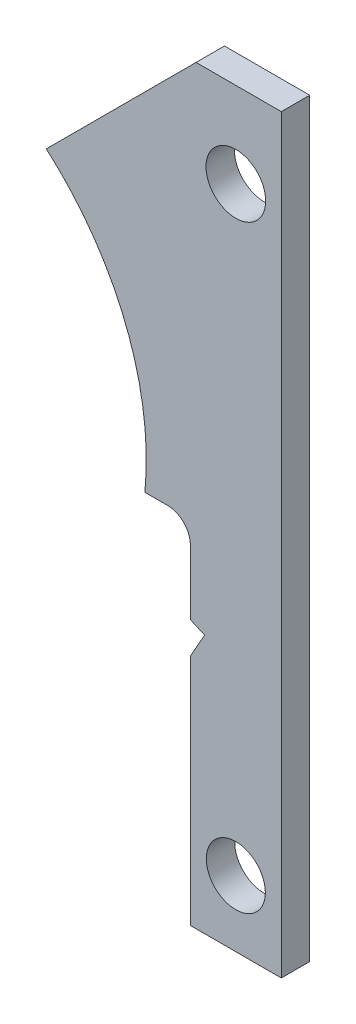
ISO-10303-21;
HEADER;
FILE_DESCRIPTION(('STEP AP214'),'2;1');
FILE_NAME('part.step','',(''),(''),'','','');
FILE_SCHEMA(('AUTOMOTIVE_DESIGN { 1 0 10303 214 1 1 1 1 }'));
ENDSEC;
DATA;
#1=APPLICATION_CONTEXT('core data for automotive mechanical design processes');
#2=APPLICATION_PROTOCOL_DEFINITION('international standard','automotive_design',2000,#1);
#3=PRODUCT_CONTEXT('',#1,'mechanical');
#4=PRODUCT('Part','Part','',(#3));
#5=PRODUCT_RELATED_PRODUCT_CATEGORY('part','',(#4));
#6=PRODUCT_DEFINITION_FORMATION('','',#4);
#7=PRODUCT_DEFINITION_CONTEXT('part definition',#1,'design');
#8=PRODUCT_DEFINITION('design','',#6,#7);
#9=PRODUCT_DEFINITION_SHAPE('','',#8);
#10=(LENGTH_UNIT() NAMED_UNIT(*) SI_UNIT(.MILLI.,.METRE.));
#11=(NAMED_UNIT(*) PLANE_ANGLE_UNIT() SI_UNIT($,.RADIAN.));
#12=(NAMED_UNIT(*) SI_UNIT($,.STERADIAN.) SOLID_ANGLE_UNIT());
#13=UNCERTAINTY_MEASURE_WITH_UNIT(LENGTH_MEASURE(1.E-05),#10,'distance_accuracy_value','');
#14=(GEOMETRIC_REPRESENTATION_CONTEXT(3) GLOBAL_UNCERTAINTY_ASSIGNED_CONTEXT((#13)) GLOBAL_UNIT_ASSIGNED_CONTEXT((#10,
#11,#12)) REPRESENTATION_CONTEXT('',''));
#15=CARTESIAN_POINT('',(0.,0.,0.));
#16=DIRECTION('',(0.,0.,1.));
#17=DIRECTION('',(1.,0.,0.));
#18=AXIS2_PLACEMENT_3D('',#15,#16,#17);
#19=CARTESIAN_POINT('',(795.076378776782,63.8094152835061,5.));
#20=DIRECTION('',(0.,0.,1.));
#21=DIRECTION('',(1.,0.,0.));
#22=AXIS2_PLACEMENT_3D('',#19,#20,#21);
#23=PLANE('',#22);
#24=CARTESIAN_POINT('',(794.600000000013,64.8000047087015,5.));
#25=DIRECTION('',(0.,0.,1.));
#26=DIRECTION('',(1.,0.,0.));
#27=AXIS2_PLACEMENT_3D('',#24,#25,#26);
#28=CIRCLE('',#27,51.25);
#29=CARTESIAN_POINT('',(845.60551440777,59.8000047087011,5.));
#30=VERTEX_POINT('',#29);
#31=CARTESIAN_POINT('',(828.252887159962,103.45289186865,5.));
#32=VERTEX_POINT('',#31);
#33=EDGE_CURVE('E48',#30,#32,#28,.T.);
#34=ORIENTED_EDGE('',*,*,#33,.F.);
#35=DIRECTION('',(1.,0.,0.));
#36=VECTOR('',#35,1.);
#37=CARTESIAN_POINT('',(820.028101645404,59.8000047086987,5.));
#38=LINE('',#37,#36);
#39=CARTESIAN_POINT('',(849.600001490012,59.8000047087015,5.));
#40=VERTEX_POINT('',#39);
#41=EDGE_CURVE('E99',#30,#40,#38,.T.);
#42=ORIENTED_EDGE('',*,*,#41,.T.);
#43=CARTESIAN_POINT('',(849.600001490012,55.8000047087015,5.));
#44=DIRECTION('',(0.,0.,-1.));
#45=DIRECTION('',(1.,0.,0.));
#46=AXIS2_PLACEMENT_3D('',#43,#44,#45);
#47=CIRCLE('',#46,4.);
#48=CARTESIAN_POINT('',(853.600001490012,55.8000047087015,5.));
#49=VERTEX_POINT('',#48);
#50=EDGE_CURVE('E184',#40,#49,#47,.T.);
#51=ORIENTED_EDGE('',*,*,#50,.T.);
#52=DIRECTION('',(0.,-1.,0.));
#53=VECTOR('',#52,1.);
#54=CARTESIAN_POINT('',(853.600001490012,55.8000047087015,5.));
#55=LINE('',#54,#53);
#56=CARTESIAN_POINT('',(853.600001490012,44.4001544028015,5.));
#57=VERTEX_POINT('',#56);
#58=EDGE_CURVE('E206',#49,#57,#55,.T.);
#59=ORIENTED_EDGE('',*,*,#58,.T.);
#60=DIRECTION('',(0.915294684400679,-0.402784856601961,0.));
#61=VECTOR('',#60,1.);
#62=CARTESIAN_POINT('',(853.600001490012,44.4001544028015,5.));
#63=LINE('',#62,#61);
#64=CARTESIAN_POINT('',(856.099999798813,43.3000043883015,5.));
#65=VERTEX_POINT('',#64);
#66=EDGE_CURVE('E203',#57,#65,#63,.T.);
#67=ORIENTED_EDGE('',*,*,#66,.T.);
#68=DIRECTION('',(-0.488075249911389,-0.872801552716272,0.));
#69=VECTOR('',#68,1.);
#70=CARTESIAN_POINT('',(856.099999798813,43.3000043883015,5.));
#71=LINE('',#70,#69);
#72=CARTESIAN_POINT('',(853.600001490012,38.8293773567015,5.));
#73=VERTEX_POINT('',#72);
#74=EDGE_CURVE('E205',#65,#73,#71,.T.);
#75=ORIENTED_EDGE('',*,*,#74,.T.);
#76=DIRECTION('',(0.,-1.,0.));
#77=VECTOR('',#76,1.);
#78=CARTESIAN_POINT('',(853.600001490012,38.8293773567015,5.));
#79=LINE('',#78,#77);
#80=CARTESIAN_POINT('',(853.600001490012,-2.19999390319852,5.));
#81=VERTEX_POINT('',#80);
#82=EDGE_CURVE('E125',#73,#81,#79,.T.);
#83=ORIENTED_EDGE('',*,*,#82,.T.);
#84=DIRECTION('',(1.,0.,0.));
#85=VECTOR('',#84,1.);
#86=CARTESIAN_POINT('',(853.600001490012,-2.19999390319852,5.));
#87=LINE('',#86,#85);
#88=CARTESIAN_POINT('',(869.600000000013,-2.19999390319852,5.));
#89=VERTEX_POINT('',#88);
#90=EDGE_CURVE('E118',#81,#89,#87,.T.);
#91=ORIENTED_EDGE('',*,*,#90,.T.);
#92=DIRECTION('',(0.,1.,0.));
#93=VECTOR('',#92,1.);
#94=CARTESIAN_POINT('',(869.600000000013,-2.19999390319852,5.));
#95=LINE('',#94,#93);
#96=CARTESIAN_POINT('',(869.600000000013,129.800004708701,5.));
#97=VERTEX_POINT('',#96);
#98=EDGE_CURVE('E122',#89,#97,#95,.T.);
#99=ORIENTED_EDGE('',*,*,#98,.T.);
#100=DIRECTION('',(-1.,0.,0.));
#101=VECTOR('',#100,1.);
#102=CARTESIAN_POINT('',(869.600000000013,129.800004708701,5.));
#103=LINE('',#102,#101);
#104=CARTESIAN_POINT('',(854.600000000013,129.800004708701,5.));
#105=VERTEX_POINT('',#104);
#106=EDGE_CURVE('E56',#97,#105,#103,.T.);
#107=ORIENTED_EDGE('',*,*,#106,.T.);
#108=DIRECTION('',(-0.707106781186541,-0.707106781186555,0.));
#109=VECTOR('',#108,1.);
#110=CARTESIAN_POINT('',(854.600000000013,129.800004708701,5.));
#111=LINE('',#110,#109);
#112=EDGE_CURVE('E222',#105,#32,#111,.T.);
#113=ORIENTED_EDGE('',*,*,#112,.T.);
#114=EDGE_LOOP('',(#34,#42,#51,#59,#67,#75,#83,#91,#99,#107,#113));
#115=FACE_BOUND('',#114,.T.);
#116=CARTESIAN_POINT('',(861.600000000013,9.39149717140147,5.));
#117=DIRECTION('',(0.,0.,1.));
#118=DIRECTION('',(1.,0.,0.));
#119=AXIS2_PLACEMENT_3D('',#116,#117,#118);
#120=CIRCLE('',#119,5.19190313570428);
#121=CARTESIAN_POINT('',(866.791903135717,9.39149717140147,5.));
#122=VERTEX_POINT('',#121);
#123=EDGE_CURVE('E149',#122,#122,#120,.T.);
#124=ORIENTED_EDGE('',*,*,#123,.F.);
#125=EDGE_LOOP('',(#124));
#126=FACE_BOUND('',#125,.T.);
#127=CARTESIAN_POINT('',(861.600000000013,114.800004708701,5.));
#128=DIRECTION('',(0.,0.,1.));
#129=DIRECTION('',(1.,0.,0.));
#130=AXIS2_PLACEMENT_3D('',#127,#128,#129);
#131=CIRCLE('',#130,5.24999999999987);
#132=CARTESIAN_POINT('',(866.850000000012,114.800004708701,5.));
#133=VERTEX_POINT('',#132);
#134=EDGE_CURVE('E216',#133,#133,#131,.T.);
#135=ORIENTED_EDGE('',*,*,#134,.F.);
#136=EDGE_LOOP('',(#135));
#137=FACE_BOUND('',#136,.T.);
#138=ADVANCED_FACE('F33',(#115,#126,#137),#23,.T.);
#139=CARTESIAN_POINT('',(795.076378776782,63.8094152835061,0.));
#140=DIRECTION('',(0.,0.,1.));
#141=DIRECTION('',(1.,0.,0.));
#142=AXIS2_PLACEMENT_3D('',#139,#140,#141);
#143=PLANE('',#142);
#144=DIRECTION('',(1.,0.,0.));
#145=VECTOR('',#144,1.);
#146=CARTESIAN_POINT('',(820.028101645404,59.8000047086987,0.));
#147=LINE('',#146,#145);
#148=CARTESIAN_POINT('',(845.60551440777,59.8000047087011,0.));
#149=VERTEX_POINT('',#148);
#150=CARTESIAN_POINT('',(849.600001490012,59.8000047087015,0.));
#151=VERTEX_POINT('',#150);
#152=EDGE_CURVE('E146',#149,#151,#147,.T.);
#153=ORIENTED_EDGE('',*,*,#152,.F.);
#154=CARTESIAN_POINT('',(794.600000000013,64.8000047087015,0.));
#155=DIRECTION('',(0.,0.,-1.));
#156=DIRECTION('',(-1.,0.,0.));
#157=AXIS2_PLACEMENT_3D('',#154,#155,#156);
#158=CIRCLE('',#157,51.25);
#159=CARTESIAN_POINT('',(828.252887159962,103.45289186865,0.));
#160=VERTEX_POINT('',#159);
#161=EDGE_CURVE('E233',#160,#149,#158,.T.);
#162=ORIENTED_EDGE('',*,*,#161,.F.);
#163=DIRECTION('',(-0.707106781186541,-0.707106781186555,0.));
#164=VECTOR('',#163,1.);
#165=CARTESIAN_POINT('',(854.600000000013,129.800004708701,0.));
#166=LINE('',#165,#164);
#167=CARTESIAN_POINT('',(854.600000000013,129.800004708701,0.));
#168=VERTEX_POINT('',#167);
#169=EDGE_CURVE('E225',#168,#160,#166,.T.);
#170=ORIENTED_EDGE('',*,*,#169,.F.);
#171=DIRECTION('',(-1.,0.,0.));
#172=VECTOR('',#171,1.);
#173=CARTESIAN_POINT('',(869.600000000013,129.800004708701,0.));
#174=LINE('',#173,#172);
#175=CARTESIAN_POINT('',(869.600000000013,129.800004708701,0.));
#176=VERTEX_POINT('',#175);
#177=EDGE_CURVE('E92',#176,#168,#174,.T.);
#178=ORIENTED_EDGE('',*,*,#177,.F.);
#179=DIRECTION('',(0.,1.,0.));
#180=VECTOR('',#179,1.);
#181=CARTESIAN_POINT('',(869.600000000013,-2.19999390319852,0.));
#182=LINE('',#181,#180);
#183=CARTESIAN_POINT('',(869.600000000013,-2.19999390319852,0.));
#184=VERTEX_POINT('',#183);
#185=EDGE_CURVE('E160',#184,#176,#182,.T.);
#186=ORIENTED_EDGE('',*,*,#185,.F.);
#187=DIRECTION('',(1.,0.,0.));
#188=VECTOR('',#187,1.);
#189=CARTESIAN_POINT('',(853.600001490012,-2.19999390319852,0.));
#190=LINE('',#189,#188);
#191=CARTESIAN_POINT('',(853.600001490012,-2.19999390319852,0.));
#192=VERTEX_POINT('',#191);
#193=EDGE_CURVE('E134',#192,#184,#190,.T.);
#194=ORIENTED_EDGE('',*,*,#193,.F.);
#195=DIRECTION('',(0.,-1.,0.));
#196=VECTOR('',#195,1.);
#197=CARTESIAN_POINT('',(853.600001490012,38.8293773567015,0.));
#198=LINE('',#197,#196);
#199=CARTESIAN_POINT('',(853.600001490012,38.8293773567015,0.));
#200=VERTEX_POINT('',#199);
#201=EDGE_CURVE('E157',#200,#192,#198,.T.);
#202=ORIENTED_EDGE('',*,*,#201,.F.);
#203=DIRECTION('',(-0.488075249911389,-0.872801552716272,0.));
#204=VECTOR('',#203,1.);
#205=CARTESIAN_POINT('',(856.099999798813,43.3000043883015,0.));
#206=LINE('',#205,#204);
#207=CARTESIAN_POINT('',(856.099999798813,43.3000043883015,0.));
#208=VERTEX_POINT('',#207);
#209=EDGE_CURVE('E155',#208,#200,#206,.T.);
#210=ORIENTED_EDGE('',*,*,#209,.F.);
#211=DIRECTION('',(0.915294684400679,-0.402784856601961,0.));
#212=VECTOR('',#211,1.);
#213=CARTESIAN_POINT('',(853.600001490012,44.4001544028015,0.));
#214=LINE('',#213,#212);
#215=CARTESIAN_POINT('',(853.600001490012,44.4001544028015,0.));
#216=VERTEX_POINT('',#215);
#217=EDGE_CURVE('E153',#216,#208,#214,.T.);
#218=ORIENTED_EDGE('',*,*,#217,.F.);
#219=DIRECTION('',(0.,-1.,0.));
#220=VECTOR('',#219,1.);
#221=CARTESIAN_POINT('',(853.600001490012,55.8000047087015,0.));
#222=LINE('',#221,#220);
#223=CARTESIAN_POINT('',(853.600001490012,55.8000047087015,0.));
#224=VERTEX_POINT('',#223);
#225=EDGE_CURVE('E151',#224,#216,#222,.T.);
#226=ORIENTED_EDGE('',*,*,#225,.F.);
#227=CARTESIAN_POINT('',(849.600001490012,55.8000047087015,0.));
#228=DIRECTION('',(0.,0.,-1.));
#229=DIRECTION('',(1.,0.,0.));
#230=AXIS2_PLACEMENT_3D('',#227,#228,#229);
#231=CIRCLE('',#230,4.);
#232=EDGE_CURVE('E148',#151,#224,#231,.T.);
#233=ORIENTED_EDGE('',*,*,#232,.F.);
#234=EDGE_LOOP('',(#153,#162,#170,#178,#186,#194,#202,#210,#218,#226,#233));
#235=FACE_BOUND('',#234,.T.);
#236=CARTESIAN_POINT('',(861.600000000013,114.800004708701,0.));
#237=DIRECTION('',(0.,0.,1.));
#238=DIRECTION('',(1.,0.,0.));
#239=AXIS2_PLACEMENT_3D('',#236,#237,#238);
#240=CIRCLE('',#239,5.24999999999987);
#241=CARTESIAN_POINT('',(866.850000000012,114.800004708701,0.));
#242=VERTEX_POINT('',#241);
#243=EDGE_CURVE('E219',#242,#242,#240,.T.);
#244=ORIENTED_EDGE('',*,*,#243,.T.);
#245=EDGE_LOOP('',(#244));
#246=FACE_BOUND('',#245,.T.);
#247=CARTESIAN_POINT('',(861.600000000013,9.39149717140147,0.));
#248=DIRECTION('',(0.,0.,1.));
#249=DIRECTION('',(1.,0.,0.));
#250=AXIS2_PLACEMENT_3D('',#247,#248,#249);
#251=CIRCLE('',#250,5.19190313570428);
#252=CARTESIAN_POINT('',(866.791903135717,9.39149717140147,0.));
#253=VERTEX_POINT('',#252);
#254=EDGE_CURVE('E213',#253,#253,#251,.T.);
#255=ORIENTED_EDGE('',*,*,#254,.T.);
#256=EDGE_LOOP('',(#255));
#257=FACE_BOUND('',#256,.T.);
#258=ADVANCED_FACE('F189',(#235,#246,#257),#143,.F.);
#259=CARTESIAN_POINT('',(820.028101645404,59.8000047086987,5.));
#260=DIRECTION('',(0.,1.,0.));
#261=DIRECTION('',(-1.,0.,0.));
#262=AXIS2_PLACEMENT_3D('',#259,#260,#261);
#263=PLANE('',#262);
#264=ORIENTED_EDGE('',*,*,#41,.F.);
#265=DIRECTION('',(0.,0.,-1.));
#266=VECTOR('',#265,1.);
#267=CARTESIAN_POINT('',(845.60551440777,59.8000047087011,6.));
#268=LINE('',#267,#266);
#269=EDGE_CURVE('E228',#30,#149,#268,.T.);
#270=ORIENTED_EDGE('',*,*,#269,.T.);
#271=ORIENTED_EDGE('',*,*,#152,.T.);
#272=DIRECTION('',(0.,0.,-1.));
#273=VECTOR('',#272,1.);
#274=CARTESIAN_POINT('',(849.600001490012,59.8000047087015,5.));
#275=LINE('',#274,#273);
#276=EDGE_CURVE('E41',#40,#151,#275,.T.);
#277=ORIENTED_EDGE('',*,*,#276,.F.);
#278=EDGE_LOOP('',(#264,#270,#271,#277));
#279=FACE_BOUND('',#278,.T.);
#280=ADVANCED_FACE('F35',(#279),#263,.F.);
#281=CARTESIAN_POINT('',(849.600001490012,55.8000047087015,5.));
#282=DIRECTION('',(0.,0.,-1.));
#283=DIRECTION('',(-1.,0.,0.));
#284=AXIS2_PLACEMENT_3D('',#281,#282,#283);
#285=CYLINDRICAL_SURFACE('',#284,4.);
#286=ORIENTED_EDGE('',*,*,#232,.T.);
#287=DIRECTION('',(0.,0.,-1.));
#288=VECTOR('',#287,1.);
#289=CARTESIAN_POINT('',(853.600001490012,55.8000047087015,5.));
#290=LINE('',#289,#288);
#291=EDGE_CURVE('E176',#49,#224,#290,.T.);
#292=ORIENTED_EDGE('',*,*,#291,.F.);
#293=ORIENTED_EDGE('',*,*,#50,.F.);
#294=ORIENTED_EDGE('',*,*,#276,.T.);
#295=EDGE_LOOP('',(#286,#292,#293,#294));
#296=FACE_BOUND('',#295,.T.);
#297=ADVANCED_FACE('F182',(#296),#285,.F.);
#298=CARTESIAN_POINT('',(853.600001490012,55.8000047087015,5.));
#299=DIRECTION('',(1.,0.,0.));
#300=DIRECTION('',(0.,0.,-1.));
#301=AXIS2_PLACEMENT_3D('',#298,#299,#300);
#302=PLANE('',#301);
#303=ORIENTED_EDGE('',*,*,#225,.T.);
#304=DIRECTION('',(0.,0.,-1.));
#305=VECTOR('',#304,1.);
#306=CARTESIAN_POINT('',(853.600001490012,44.4001544028015,5.));
#307=LINE('',#306,#305);
#308=EDGE_CURVE('E173',#57,#216,#307,.T.);
#309=ORIENTED_EDGE('',*,*,#308,.F.);
#310=ORIENTED_EDGE('',*,*,#58,.F.);
#311=ORIENTED_EDGE('',*,*,#291,.T.);
#312=EDGE_LOOP('',(#303,#309,#310,#311));
#313=FACE_BOUND('',#312,.T.);
#314=ADVANCED_FACE('F197',(#313),#302,.F.);
#315=CARTESIAN_POINT('',(853.600001490012,44.4001544028015,5.));
#316=DIRECTION('',(0.402784856601961,0.915294684400679,0.));
#317=DIRECTION('',(-0.915294684400679,0.402784856601961,0.));
#318=AXIS2_PLACEMENT_3D('',#315,#316,#317);
#319=PLANE('',#318);
#320=ORIENTED_EDGE('',*,*,#217,.T.);
#321=DIRECTION('',(0.,0.,-1.));
#322=VECTOR('',#321,1.);
#323=CARTESIAN_POINT('',(856.099999798813,43.3000043883015,5.));
#324=LINE('',#323,#322);
#325=EDGE_CURVE('E170',#65,#208,#324,.T.);
#326=ORIENTED_EDGE('',*,*,#325,.F.);
#327=ORIENTED_EDGE('',*,*,#66,.F.);
#328=ORIENTED_EDGE('',*,*,#308,.T.);
#329=EDGE_LOOP('',(#320,#326,#327,#328));
#330=FACE_BOUND('',#329,.T.);
#331=ADVANCED_FACE('F201',(#330),#319,.F.);
#332=CARTESIAN_POINT('',(856.099999798813,43.3000043883015,5.));
#333=DIRECTION('',(0.872801552716272,-0.488075249911389,0.));
#334=DIRECTION('',(0.488075249911389,0.872801552716272,0.));
#335=AXIS2_PLACEMENT_3D('',#332,#333,#334);
#336=PLANE('',#335);
#337=ORIENTED_EDGE('',*,*,#209,.T.);
#338=DIRECTION('',(0.,0.,-1.));
#339=VECTOR('',#338,1.);
#340=CARTESIAN_POINT('',(853.600001490012,38.8293773567015,5.));
#341=LINE('',#340,#339);
#342=EDGE_CURVE('E167',#73,#200,#341,.T.);
#343=ORIENTED_EDGE('',*,*,#342,.F.);
#344=ORIENTED_EDGE('',*,*,#74,.F.);
#345=ORIENTED_EDGE('',*,*,#325,.T.);
#346=EDGE_LOOP('',(#337,#343,#344,#345));
#347=FACE_BOUND('',#346,.T.);
#348=ADVANCED_FACE('F261',(#347),#336,.F.);
#349=CARTESIAN_POINT('',(853.600001490012,38.8293773567015,5.));
#350=DIRECTION('',(1.,0.,0.));
#351=DIRECTION('',(0.,0.,-1.));
#352=AXIS2_PLACEMENT_3D('',#349,#350,#351);
#353=PLANE('',#352);
#354=ORIENTED_EDGE('',*,*,#201,.T.);
#355=DIRECTION('',(0.,0.,-1.));
#356=VECTOR('',#355,1.);
#357=CARTESIAN_POINT('',(853.600001490012,-2.19999390319852,5.));
#358=LINE('',#357,#356);
#359=EDGE_CURVE('E137',#81,#192,#358,.T.);
#360=ORIENTED_EDGE('',*,*,#359,.F.);
#361=ORIENTED_EDGE('',*,*,#82,.F.);
#362=ORIENTED_EDGE('',*,*,#342,.T.);
#363=EDGE_LOOP('',(#354,#360,#361,#362));
#364=FACE_BOUND('',#363,.T.);
#365=ADVANCED_FACE('F258',(#364),#353,.F.);
#366=CARTESIAN_POINT('',(853.600001490012,-2.19999390319852,5.));
#367=DIRECTION('',(0.,1.,0.));
#368=DIRECTION('',(0.,0.,1.));
#369=AXIS2_PLACEMENT_3D('',#366,#367,#368);
#370=PLANE('',#369);
#371=ORIENTED_EDGE('',*,*,#193,.T.);
#372=DIRECTION('',(0.,0.,-1.));
#373=VECTOR('',#372,1.);
#374=CARTESIAN_POINT('',(869.600000000013,-2.19999390319852,5.));
#375=LINE('',#374,#373);
#376=EDGE_CURVE('E131',#89,#184,#375,.T.);
#377=ORIENTED_EDGE('',*,*,#376,.F.);
#378=ORIENTED_EDGE('',*,*,#90,.F.);
#379=ORIENTED_EDGE('',*,*,#359,.T.);
#380=EDGE_LOOP('',(#371,#377,#378,#379));
#381=FACE_BOUND('',#380,.T.);
#382=ADVANCED_FACE('F132',(#381),#370,.F.);
#383=CARTESIAN_POINT('',(869.600000000013,-2.19999390319852,5.));
#384=DIRECTION('',(-1.,0.,0.));
#385=DIRECTION('',(0.,0.,1.));
#386=AXIS2_PLACEMENT_3D('',#383,#384,#385);
#387=PLANE('',#386);
#388=ORIENTED_EDGE('',*,*,#185,.T.);
#389=DIRECTION('',(0.,0.,-1.));
#390=VECTOR('',#389,1.);
#391=CARTESIAN_POINT('',(869.600000000013,129.800004708701,5.));
#392=LINE('',#391,#390);
#393=EDGE_CURVE('E138',#97,#176,#392,.T.);
#394=ORIENTED_EDGE('',*,*,#393,.F.);
#395=ORIENTED_EDGE('',*,*,#98,.F.);
#396=ORIENTED_EDGE('',*,*,#376,.T.);
#397=EDGE_LOOP('',(#388,#394,#395,#396));
#398=FACE_BOUND('',#397,.T.);
#399=ADVANCED_FACE('F140',(#398),#387,.F.);
#400=CARTESIAN_POINT('',(869.600000000013,129.800004708701,5.));
#401=DIRECTION('',(0.,-1.,0.));
#402=DIRECTION('',(0.,0.,-1.));
#403=AXIS2_PLACEMENT_3D('',#400,#401,#402);
#404=PLANE('',#403);
#405=ORIENTED_EDGE('',*,*,#177,.T.);
#406=DIRECTION('',(0.,0.,-1.));
#407=VECTOR('',#406,1.);
#408=CARTESIAN_POINT('',(854.600000000013,129.800004708701,5.));
#409=LINE('',#408,#407);
#410=EDGE_CURVE('E142',#105,#168,#409,.T.);
#411=ORIENTED_EDGE('',*,*,#410,.F.);
#412=ORIENTED_EDGE('',*,*,#106,.F.);
#413=ORIENTED_EDGE('',*,*,#393,.T.);
#414=EDGE_LOOP('',(#405,#411,#412,#413));
#415=FACE_BOUND('',#414,.T.);
#416=ADVANCED_FACE('F251',(#415),#404,.F.);
#417=CARTESIAN_POINT('',(861.600000000013,9.39149717140147,5.));
#418=DIRECTION('',(0.,0.,-1.));
#419=DIRECTION('',(-1.,0.,0.));
#420=AXIS2_PLACEMENT_3D('',#417,#418,#419);
#421=CYLINDRICAL_SURFACE('',#420,5.19190313570428);
#422=ORIENTED_EDGE('',*,*,#123,.T.);
#423=EDGE_LOOP('',(#422));
#424=FACE_BOUND('',#423,.T.);
#425=ORIENTED_EDGE('',*,*,#254,.F.);
#426=EDGE_LOOP('',(#425));
#427=FACE_BOUND('',#426,.T.);
#428=ADVANCED_FACE('F248',(#424,#427),#421,.F.);
#429=CARTESIAN_POINT('',(861.600000000013,114.800004708701,5.));
#430=DIRECTION('',(0.,0.,-1.));
#431=DIRECTION('',(-1.,0.,0.));
#432=AXIS2_PLACEMENT_3D('',#429,#430,#431);
#433=CYLINDRICAL_SURFACE('',#432,5.24999999999987);
#434=ORIENTED_EDGE('',*,*,#134,.T.);
#435=EDGE_LOOP('',(#434));
#436=FACE_BOUND('',#435,.T.);
#437=ORIENTED_EDGE('',*,*,#243,.F.);
#438=EDGE_LOOP('',(#437));
#439=FACE_BOUND('',#438,.T.);
#440=ADVANCED_FACE('F304',(#436,#439),#433,.F.);
#441=CARTESIAN_POINT('',(854.600000000013,129.800004708701,5.));
#442=DIRECTION('',(0.707106781186555,-0.707106781186541,0.));
#443=DIRECTION('',(0.707106781186541,0.707106781186555,0.));
#444=AXIS2_PLACEMENT_3D('',#441,#442,#443);
#445=PLANE('',#444);
#446=ORIENTED_EDGE('',*,*,#169,.T.);
#447=DIRECTION('',(0.,0.,-1.));
#448=VECTOR('',#447,1.);
#449=CARTESIAN_POINT('',(828.252887159962,103.45289186865,6.));
#450=LINE('',#449,#448);
#451=EDGE_CURVE('E11',#160,#32,#450,.F.);
#452=ORIENTED_EDGE('',*,*,#451,.T.);
#453=ORIENTED_EDGE('',*,*,#112,.F.);
#454=ORIENTED_EDGE('',*,*,#410,.T.);
#455=EDGE_LOOP('',(#446,#452,#453,#454));
#456=FACE_BOUND('',#455,.T.);
#457=ADVANCED_FACE('F310',(#456),#445,.F.);
#458=CARTESIAN_POINT('',(794.600000000013,64.8000047087015,6.));
#459=DIRECTION('',(0.,0.,-1.));
#460=DIRECTION('',(-1.,0.,0.));
#461=AXIS2_PLACEMENT_3D('',#458,#459,#460);
#462=CYLINDRICAL_SURFACE('',#461,51.25);
#463=ORIENTED_EDGE('',*,*,#33,.T.);
#464=ORIENTED_EDGE('',*,*,#451,.F.);
#465=ORIENTED_EDGE('',*,*,#161,.T.);
#466=ORIENTED_EDGE('',*,*,#269,.F.);
#467=EDGE_LOOP('',(#463,#464,#465,#466));
#468=FACE_BOUND('',#467,.T.);
#469=ADVANCED_FACE('F235',(#468),#462,.F.);
#470=CLOSED_SHELL('',(#138,#258,#280,#297,#314,#331,#348,#365,#382,#399,#416,#428,#440,#457,#469));
#471=MANIFOLD_SOLID_BREP('B2',#470);
#472=ADVANCED_BREP_SHAPE_REPRESENTATION('',(#18,#471),#14);
#473=SHAPE_DEFINITION_REPRESENTATION(#9,#472);
ENDSEC;
END-ISO-10303-21;
